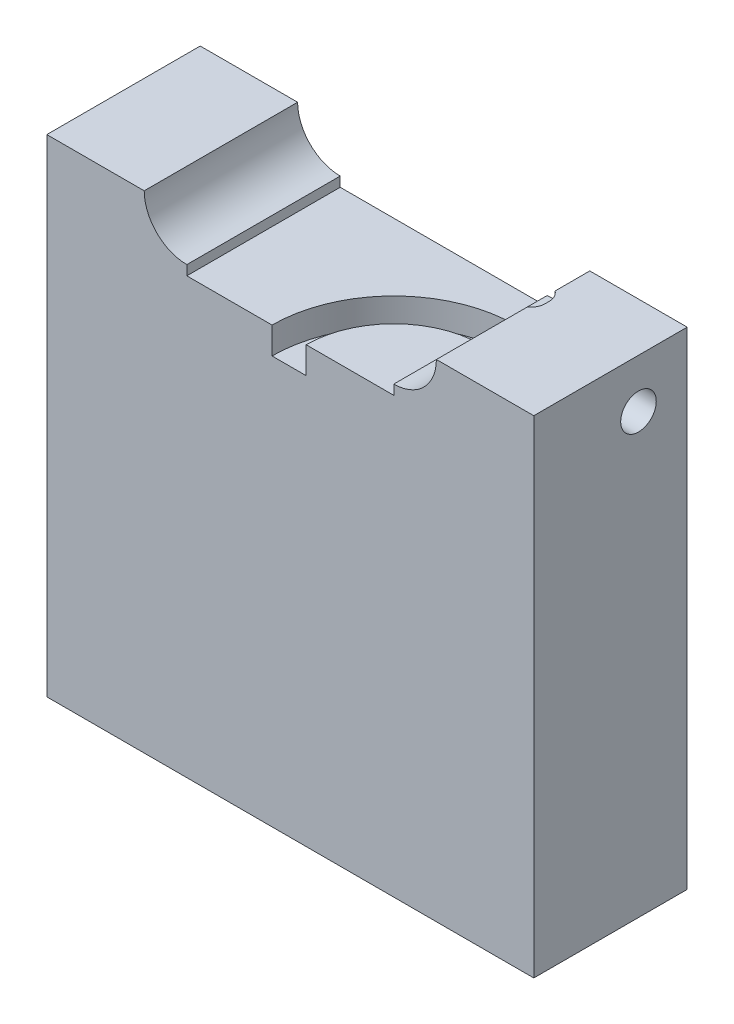
ISO-10303-21;
HEADER;
FILE_DESCRIPTION(('STEP AP214'),'2;1');
FILE_NAME('part.step','',(''),(''),'','','');
FILE_SCHEMA(('AUTOMOTIVE_DESIGN { 1 0 10303 214 1 1 1 1 }'));
ENDSEC;
DATA;
#1=APPLICATION_CONTEXT('core data for automotive mechanical design processes');
#2=APPLICATION_PROTOCOL_DEFINITION('international standard','automotive_design',2000,#1);
#3=PRODUCT_CONTEXT('',#1,'mechanical');
#4=PRODUCT('Part','Part','',(#3));
#5=PRODUCT_RELATED_PRODUCT_CATEGORY('part','',(#4));
#6=PRODUCT_DEFINITION_FORMATION('','',#4);
#7=PRODUCT_DEFINITION_CONTEXT('part definition',#1,'design');
#8=PRODUCT_DEFINITION('design','',#6,#7);
#9=PRODUCT_DEFINITION_SHAPE('','',#8);
#10=(LENGTH_UNIT() NAMED_UNIT(*) SI_UNIT(.MILLI.,.METRE.));
#11=(NAMED_UNIT(*) PLANE_ANGLE_UNIT() SI_UNIT($,.RADIAN.));
#12=(NAMED_UNIT(*) SI_UNIT($,.STERADIAN.) SOLID_ANGLE_UNIT());
#13=UNCERTAINTY_MEASURE_WITH_UNIT(LENGTH_MEASURE(1.E-05),#10,'distance_accuracy_value','');
#14=(GEOMETRIC_REPRESENTATION_CONTEXT(3) GLOBAL_UNCERTAINTY_ASSIGNED_CONTEXT((#13)) GLOBAL_UNIT_ASSIGNED_CONTEXT((#10,
#11,#12)) REPRESENTATION_CONTEXT('',''));
#15=CARTESIAN_POINT('',(0.,0.,0.));
#16=DIRECTION('',(0.,0.,1.));
#17=DIRECTION('',(1.,0.,0.));
#18=AXIS2_PLACEMENT_3D('',#15,#16,#17);
#19=CARTESIAN_POINT('',(5.3975,25.4,4.0005));
#20=DIRECTION('',(0.,-1.,0.));
#21=DIRECTION('',(1.,0.,0.));
#22=AXIS2_PLACEMENT_3D('',#19,#20,#21);
#23=CYLINDRICAL_SURFACE('',#22,6.35);
#24=DIRECTION('',(0.,-1.,0.));
#25=VECTOR('',#24,1.);
#26=CARTESIAN_POINT('',(5.3975,25.4,-2.3495));
#27=LINE('',#26,#25);
#28=CARTESIAN_POINT('',(5.3975,22.6695,-2.3495));
#29=VERTEX_POINT('',#28);
#30=CARTESIAN_POINT('',(5.3975,21.2725,-2.3495));
#31=VERTEX_POINT('',#30);
#32=EDGE_CURVE('E452',#29,#31,#27,.T.);
#33=ORIENTED_EDGE('',*,*,#32,.F.);
#34=CARTESIAN_POINT('',(5.3975,22.6695,4.0005));
#35=DIRECTION('',(0.,1.,0.));
#36=DIRECTION('',(-1.,0.,0.));
#37=AXIS2_PLACEMENT_3D('',#34,#35,#36);
#38=CIRCLE('',#37,6.35);
#39=CARTESIAN_POINT('',(-0.9525,22.6695,4.0005));
#40=VERTEX_POINT('',#39);
#41=EDGE_CURVE('E239',#29,#40,#38,.T.);
#42=ORIENTED_EDGE('',*,*,#41,.T.);
#43=DIRECTION('',(0.,-1.,0.));
#44=VECTOR('',#43,1.);
#45=CARTESIAN_POINT('',(-0.952499999999999,25.4,4.0005));
#46=LINE('',#45,#44);
#47=CARTESIAN_POINT('',(-0.952500000000001,21.2725,4.0005));
#48=VERTEX_POINT('',#47);
#49=EDGE_CURVE('E230',#40,#48,#46,.T.);
#50=ORIENTED_EDGE('',*,*,#49,.T.);
#51=CARTESIAN_POINT('',(5.3975,21.2725,4.0005));
#52=DIRECTION('',(0.,1.,0.));
#53=DIRECTION('',(-1.,0.,0.));
#54=AXIS2_PLACEMENT_3D('',#51,#52,#53);
#55=CIRCLE('',#54,6.35);
#56=EDGE_CURVE('E468',#31,#48,#55,.T.);
#57=ORIENTED_EDGE('',*,*,#56,.F.);
#58=EDGE_LOOP('',(#33,#42,#50,#57));
#59=FACE_BOUND('',#58,.T.);
#60=ADVANCED_FACE('F33',(#59),#23,.F.);
#61=CARTESIAN_POINT('',(5.3975,25.4,4.0005));
#62=DIRECTION('',(0.,-1.,0.));
#63=DIRECTION('',(1.,0.,0.));
#64=AXIS2_PLACEMENT_3D('',#61,#62,#63);
#65=CYLINDRICAL_SURFACE('',#64,4.572);
#66=DIRECTION('',(0.,-1.,0.));
#67=VECTOR('',#66,1.);
#68=CARTESIAN_POINT('',(0.825500000000001,25.4,4.0005));
#69=LINE('',#68,#67);
#70=CARTESIAN_POINT('',(0.8255,22.6695,4.0005));
#71=VERTEX_POINT('',#70);
#72=CARTESIAN_POINT('',(0.825499999999999,21.2725,4.0005));
#73=VERTEX_POINT('',#72);
#74=EDGE_CURVE('E450',#71,#73,#69,.T.);
#75=ORIENTED_EDGE('',*,*,#74,.F.);
#76=CARTESIAN_POINT('',(5.3975,22.6695,4.0005));
#77=DIRECTION('',(0.,1.,0.));
#78=DIRECTION('',(-1.,0.,0.));
#79=AXIS2_PLACEMENT_3D('',#76,#77,#78);
#80=CIRCLE('',#79,4.572);
#81=CARTESIAN_POINT('',(5.3975,22.6695,-0.571499999999999));
#82=VERTEX_POINT('',#81);
#83=EDGE_CURVE('E11',#71,#82,#80,.F.);
#84=ORIENTED_EDGE('',*,*,#83,.T.);
#85=DIRECTION('',(0.,-1.,0.));
#86=VECTOR('',#85,1.);
#87=CARTESIAN_POINT('',(5.3975,25.4,-0.571499999999999));
#88=LINE('',#87,#86);
#89=CARTESIAN_POINT('',(5.3975,21.2725,-0.571499999999999));
#90=VERTEX_POINT('',#89);
#91=EDGE_CURVE('E428',#82,#90,#88,.T.);
#92=ORIENTED_EDGE('',*,*,#91,.T.);
#93=CARTESIAN_POINT('',(5.3975,21.2725,4.0005));
#94=DIRECTION('',(0.,-1.,0.));
#95=DIRECTION('',(-1.,0.,0.));
#96=AXIS2_PLACEMENT_3D('',#93,#94,#95);
#97=CIRCLE('',#96,4.572);
#98=EDGE_CURVE('E444',#73,#90,#97,.T.);
#99=ORIENTED_EDGE('',*,*,#98,.F.);
#100=EDGE_LOOP('',(#75,#84,#92,#99));
#101=FACE_BOUND('',#100,.T.);
#102=ADVANCED_FACE('F515',(#101),#65,.T.);
#103=CARTESIAN_POINT('',(7.14375,25.4,-1.36525));
#104=DIRECTION('',(0.,-1.,0.));
#105=DIRECTION('',(1.,0.,0.));
#106=AXIS2_PLACEMENT_3D('',#103,#104,#105);
#107=CYLINDRICAL_SURFACE('',#106,0.79375);
#108=CARTESIAN_POINT('',(7.14375,23.1230464027505,-0.571499999999999));
#109=CARTESIAN_POINT('',(7.15893791785662,23.1229781622669,-0.57148921704763));
#110=CARTESIAN_POINT('',(7.17400569118337,23.124520458918,-0.571934888400934));
#111=CARTESIAN_POINT('',(7.2033431203434,23.1300966910771,-0.573609679749041));
#112=CARTESIAN_POINT('',(7.2176225803887,23.1340818079715,-0.574823464377439));
#113=CARTESIAN_POINT('',(7.25380469471549,23.1468082711699,-0.578843564999055));
#114=CARTESIAN_POINT('',(7.27512209176527,23.1569686475094,-0.582168697431571));
#115=CARTESIAN_POINT('',(7.31633968048021,23.1797623078841,-0.590203083478792));
#116=CARTESIAN_POINT('',(7.3362195987784,23.1924240312471,-0.594928600893243));
#117=CARTESIAN_POINT('',(7.37787042940221,23.2211125710446,-0.606458135167337));
#118=CARTESIAN_POINT('',(7.39943301006975,23.2373533586215,-0.613473986199112));
#119=CARTESIAN_POINT('',(7.44138305141542,23.270593693588,-0.629075213734984));
#120=CARTESIAN_POINT('',(7.46176933083153,23.2875939742988,-0.637662133053712));
#121=CARTESIAN_POINT('',(7.52143193640342,23.3389203174978,-0.665728056056787));
#122=CARTESIAN_POINT('',(7.5593005677582,23.3736393239732,-0.687537596010284));
#123=CARTESIAN_POINT('',(7.6384185132863,23.448430775985,-0.742299278746401));
#124=CARTESIAN_POINT('',(7.67896795887997,23.4882846809269,-0.776574581298044));
#125=CARTESIAN_POINT('',(7.75403094099642,23.5640168410449,-0.854840077472445));
#126=CARTESIAN_POINT('',(7.78855810799547,23.5999040050053,-0.898807808999805));
#127=CARTESIAN_POINT('',(7.83769152755565,23.6526476479051,-0.97824481695104));
#128=CARTESIAN_POINT('',(7.85491185054323,23.6715928274382,-1.01071440914583));
#129=CARTESIAN_POINT('',(7.88511096397852,23.7059280219605,-1.07921260408973));
#130=CARTESIAN_POINT('',(7.89810333803432,23.721329374934,-1.11522931488016));
#131=CARTESIAN_POINT('',(7.91781786866114,23.7462994434745,-1.18619777652733));
#132=CARTESIAN_POINT('',(7.92506881061526,23.7563207127409,-1.22083829691442));
#133=CARTESIAN_POINT('',(7.93245517265906,23.768352232104,-1.27409390820124));
#134=CARTESIAN_POINT('',(7.93433608261142,23.7718715687023,-1.29214513676568));
#135=CARTESIAN_POINT('',(7.93686009185863,23.7778440916586,-1.3285246385013));
#136=CARTESIAN_POINT('',(7.93750208529729,23.7802963240094,-1.34685314447942));
#137=CARTESIAN_POINT('',(7.9375,23.782194040048,-1.36525));
#138=B_SPLINE_CURVE_WITH_KNOTS('',3,(#108,#109,#110,#111,#112,#113,#114,#115,#116,#117,#118,
#119,#120,#121,#122,#123,#124,#125,#126,#127,#128,#129,#130,#131,#132,#133,#134,#135,#136,#137),
.UNSPECIFIED.,.F.,.F.,(4,2,2,2,2,2,2,2,2,2,2,2,2,2,4),(0.,0.0452895664750743,0.0897022840237438,
0.160849075138673,0.232856893385683,0.316417547963794,0.400060705247954,0.567007309525601,
0.765293828106061,0.963125562501132,1.08674096362218,1.2099551978823,1.31975004138663,
1.37514445888962,1.43058829859037),.UNSPECIFIED.);
#139=CARTESIAN_POINT('',(7.14375,23.1230464027505,-0.571499999999999));
#140=VERTEX_POINT('',#139);
#141=CARTESIAN_POINT('',(7.9375,23.782194040048,-1.36525));
#142=VERTEX_POINT('',#141);
#143=EDGE_CURVE('E288',#140,#142,#138,.T.);
#144=ORIENTED_EDGE('',*,*,#143,.F.);
#145=DIRECTION('',(0.,-1.,0.));
#146=VECTOR('',#145,1.);
#147=CARTESIAN_POINT('',(7.14375,25.4,-0.571499999999999));
#148=LINE('',#147,#146);
#149=CARTESIAN_POINT('',(7.14375,24.0251846714922,-0.571499999999999));
#150=VERTEX_POINT('',#149);
#151=EDGE_CURVE('E420',#150,#140,#148,.T.);
#152=ORIENTED_EDGE('',*,*,#151,.F.);
#153=CARTESIAN_POINT('',(7.14375,24.0251846714922,-0.571499999999999));
#154=CARTESIAN_POINT('',(7.17493882903404,24.0647904593139,-0.571515966067028));
#155=CARTESIAN_POINT('',(7.20473558813774,24.1054189700609,-0.573336101510383));
#156=CARTESIAN_POINT('',(7.26136996565832,24.1883868944046,-0.579743127296266));
#157=CARTESIAN_POINT('',(7.28821258149453,24.2307232477426,-0.58432525746599));
#158=CARTESIAN_POINT('',(7.3389098633342,24.316975133551,-0.595428843915839));
#159=CARTESIAN_POINT('',(7.36275997006245,24.3608929475555,-0.601953209514282));
#160=CARTESIAN_POINT('',(7.40738778736858,24.4500808312739,-0.616195180263885));
#161=CARTESIAN_POINT('',(7.4281640525646,24.4953515251891,-0.623913343295498));
#162=CARTESIAN_POINT('',(7.48841301880205,24.6391746871459,-0.648856798326211));
#163=CARTESIAN_POINT('',(7.52239504808017,24.7399758849743,-0.666944970405778));
#164=CARTESIAN_POINT('',(7.56234987491672,24.89428448952,-0.690674889170688));
#165=CARTESIAN_POINT('',(7.57382524483121,24.9461801786835,-0.698011648198737));
#166=CARTESIAN_POINT('',(7.59305267803054,25.0508824439455,-0.710803547908302));
#167=CARTESIAN_POINT('',(7.6008067955423,25.1036885007802,-0.716259726248792));
#168=CARTESIAN_POINT('',(7.61108668898027,25.1970681393693,-0.723637621390587));
#169=CARTESIAN_POINT('',(7.6144233283184,25.2375119988091,-0.726094970736021));
#170=CARTESIAN_POINT('',(7.61888265518496,25.3186335235272,-0.729411979066943));
#171=CARTESIAN_POINT('',(7.62000273710662,25.359311407665,-0.730269757657389));
#172=CARTESIAN_POINT('',(7.62,25.4,-0.730250000000001));
#173=B_SPLINE_CURVE_WITH_KNOTS('',3,(#153,#154,#155,#156,#157,#158,#159,#160,#161,#162,#163,
#164,#165,#166,#167,#168,#169,#170,#171,#172),.UNSPECIFIED.,.F.,.F.,(4,2,2,2,2,2,2,2,2,4),(0.,
0.151091968467235,0.301924278346462,0.452983670059184,0.604113868697302,0.926493060198708,
1.08733203777103,1.2480821256733,1.36996150858661,1.49198407820245),.UNSPECIFIED.);
#174=CARTESIAN_POINT('',(7.62,25.4,-0.730250000000001));
#175=VERTEX_POINT('',#174);
#176=EDGE_CURVE('E310',#150,#175,#173,.T.);
#177=ORIENTED_EDGE('',*,*,#176,.T.);
#178=CARTESIAN_POINT('',(7.14375,25.4,-1.36525));
#179=DIRECTION('',(0.,1.,0.));
#180=DIRECTION('',(1.,0.,0.));
#181=AXIS2_PLACEMENT_3D('',#178,#179,#180);
#182=CIRCLE('',#181,0.79375);
#183=CARTESIAN_POINT('',(7.9375,25.4,-1.36525));
#184=VERTEX_POINT('',#183);
#185=EDGE_CURVE('E438',#175,#184,#182,.T.);
#186=ORIENTED_EDGE('',*,*,#185,.T.);
#187=DIRECTION('',(0.,-1.,0.));
#188=VECTOR('',#187,1.);
#189=CARTESIAN_POINT('',(7.9375,25.4,-1.36525));
#190=LINE('',#189,#188);
#191=EDGE_CURVE('E355',#184,#142,#190,.T.);
#192=ORIENTED_EDGE('',*,*,#191,.T.);
#193=EDGE_LOOP('',(#144,#152,#177,#186,#192));
#194=FACE_BOUND('',#193,.T.);
#195=ADVANCED_FACE('F302',(#194),#107,.F.);
#196=CARTESIAN_POINT('',(7.14375,25.4,-1.55575));
#197=DIRECTION('',(0.,-1.,0.));
#198=DIRECTION('',(1.,0.,0.));
#199=AXIS2_PLACEMENT_3D('',#196,#197,#198);
#200=CYLINDRICAL_SURFACE('',#199,0.79375);
#201=CARTESIAN_POINT('',(7.9375,23.782194040048,-1.55575));
#202=CARTESIAN_POINT('',(7.93750241256332,23.7801936525798,-1.57514478348495));
#203=CARTESIAN_POINT('',(7.93678870871886,23.7775767551003,-1.5944621743929));
#204=CARTESIAN_POINT('',(7.93398641219166,23.7711587801819,-1.63277953405351));
#205=CARTESIAN_POINT('',(7.93189915885152,23.7673588582055,-1.65177979355258));
#206=CARTESIAN_POINT('',(7.92371352293545,23.7543339271178,-1.70775715508424));
#207=CARTESIAN_POINT('',(7.91568889593077,23.7434433707352,-1.74408855282001));
#208=CARTESIAN_POINT('',(7.89523776010599,23.7179176659708,-1.81387248338225));
#209=CARTESIAN_POINT('',(7.88282703010999,23.7032959918654,-1.8473348082929));
#210=CARTESIAN_POINT('',(7.85435108605226,23.6709943364583,-1.9111502135495));
#211=CARTESIAN_POINT('',(7.83827706911013,23.6533070133269,-1.9414955446917));
#212=CARTESIAN_POINT('',(7.7950458041358,23.6068268517615,-2.01212150391445));
#213=CARTESIAN_POINT('',(7.76620526596445,23.5766872046281,-2.05048526942747));
#214=CARTESIAN_POINT('',(7.7038617611406,23.5131883580013,-2.12011411534587));
#215=CARTESIAN_POINT('',(7.67034850885851,23.4798221071251,-2.1513631238535));
#216=CARTESIAN_POINT('',(7.59865541927082,23.4104677895308,-2.20785803437785));
#217=CARTESIAN_POINT('',(7.56037261542772,23.3744328617208,-2.23291527401671));
#218=CARTESIAN_POINT('',(7.50013032175957,23.3206006600362,-2.26536164838984));
#219=CARTESIAN_POINT('',(7.47959277776842,23.3027037493227,-2.27531618012629));
#220=CARTESIAN_POINT('',(7.43740812370541,23.2673727822183,-2.29353925463318));
#221=CARTESIAN_POINT('',(7.41576180347948,23.249938409412,-2.30180897725127));
#222=CARTESIAN_POINT('',(7.37545059999081,23.2195567149893,-2.31516497950012));
#223=CARTESIAN_POINT('',(7.35704266951005,23.206403873353,-2.32055739616009));
#224=CARTESIAN_POINT('',(7.31896103433901,23.1815037640402,-2.33017004709823));
#225=CARTESIAN_POINT('',(7.29928734644972,23.169756477713,-2.33439029693117));
#226=CARTESIAN_POINT('',(7.26442510912181,23.1521227309386,-2.34040819331776));
#227=CARTESIAN_POINT('',(7.2496600372804,23.1455350172339,-2.34255282231827));
#228=CARTESIAN_POINT('',(7.21928974650044,23.134519893377,-2.34604332277608));
#229=CARTESIAN_POINT('',(7.20368955538529,23.1300808834197,-2.34739349186303));
#230=CARTESIAN_POINT('',(7.18055609109638,23.1258076177804,-2.34867942917183));
#231=CARTESIAN_POINT('',(7.17325894960944,23.1247822406778,-2.34898501857166));
#232=CARTESIAN_POINT('',(7.15856018619976,23.1233972488647,-2.34939622095228));
#233=CARTESIAN_POINT('',(7.15115822518164,23.1230409698786,-2.34950083203409));
#234=CARTESIAN_POINT('',(7.14375,23.1230464027505,-2.3495));
#235=B_SPLINE_CURVE_WITH_KNOTS('',3,(#201,#202,#203,#204,#205,#206,#207,#208,#209,#210,#211,
#212,#213,#214,#215,#216,#217,#218,#219,#220,#221,#222,#223,#224,#225,#226,#227,#228,#229,#230,
#231,#232,#233,#234),.UNSPECIFIED.,.F.,.F.,(4,2,2,2,2,2,2,2,2,2,2,2,2,2,2,2,4),(0.,
0.0584453265147484,0.116833747504299,0.232488737897986,0.347731829907224,0.463254826944109,
0.632339979221334,0.801803378714479,0.975925812136694,1.06288483108186,1.14978274295621,
1.21949579483512,1.28920792157083,1.33802178064912,1.38656909412918,1.40866379827516,
1.43086836401874),.UNSPECIFIED.);
#236=CARTESIAN_POINT('',(7.9375,23.782194040048,-1.55575));
#237=VERTEX_POINT('',#236);
#238=CARTESIAN_POINT('',(7.14375,23.1230464027505,-2.3495));
#239=VERTEX_POINT('',#238);
#240=EDGE_CURVE('E283',#237,#239,#235,.T.);
#241=ORIENTED_EDGE('',*,*,#240,.F.);
#242=DIRECTION('',(0.,-1.,0.));
#243=VECTOR('',#242,1.);
#244=CARTESIAN_POINT('',(7.9375,25.4,-1.55575));
#245=LINE('',#244,#243);
#246=CARTESIAN_POINT('',(7.9375,25.4,-1.55575));
#247=VERTEX_POINT('',#246);
#248=EDGE_CURVE('E345',#247,#237,#245,.T.);
#249=ORIENTED_EDGE('',*,*,#248,.F.);
#250=CARTESIAN_POINT('',(7.14375,25.4,-1.55575));
#251=DIRECTION('',(0.,1.,0.));
#252=DIRECTION('',(-1.,0.,0.));
#253=AXIS2_PLACEMENT_3D('',#250,#251,#252);
#254=CIRCLE('',#253,0.79375);
#255=CARTESIAN_POINT('',(7.62,25.4,-2.19075));
#256=VERTEX_POINT('',#255);
#257=EDGE_CURVE('E441',#247,#256,#254,.T.);
#258=ORIENTED_EDGE('',*,*,#257,.T.);
#259=CARTESIAN_POINT('',(7.62,25.4,-2.19075));
#260=CARTESIAN_POINT('',(7.62000808222504,25.3476620086764,-2.19069678540611));
#261=CARTESIAN_POINT('',(7.61815174304964,25.2953473715379,-2.19213629686457));
#262=CARTESIAN_POINT('',(7.61078125391763,25.1911829924741,-2.19758908145641));
#263=CARTESIAN_POINT('',(7.60527233116839,25.1393326933517,-2.20159867627471));
#264=CARTESIAN_POINT('',(7.59066211493761,25.0363268479517,-2.21178576557001));
#265=CARTESIAN_POINT('',(7.58155825030525,24.9851718260926,-2.21796481131604));
#266=CARTESIAN_POINT('',(7.55984658447069,24.8838125931217,-2.23181870998652));
#267=CARTESIAN_POINT('',(7.5472375453096,24.8336087246421,-2.23949409110067));
#268=CARTESIAN_POINT('',(7.50289921844771,24.6799016765049,-2.26443820747756));
#269=CARTESIAN_POINT('',(7.46535418005992,24.5782472369929,-2.2830066799425));
#270=CARTESIAN_POINT('',(7.37568261057651,24.3812061917664,-2.31636202096677));
#271=CARTESIAN_POINT('',(7.32360883953244,24.2857984212855,-2.33116220863326));
#272=CARTESIAN_POINT('',(7.2458227786617,24.1653311257623,-2.3431368661238));
#273=CARTESIAN_POINT('',(7.22636452973083,24.1366863514485,-2.34544747485569));
#274=CARTESIAN_POINT('',(7.18607326983955,24.0802594935604,-2.34862852535922));
#275=CARTESIAN_POINT('',(7.16523897881772,24.0524782496364,-2.34949760595795));
#276=CARTESIAN_POINT('',(7.14375,24.0251846714922,-2.3495));
#277=B_SPLINE_CURVE_WITH_KNOTS('',3,(#259,#260,#261,#262,#263,#264,#265,#266,#267,#268,#269,
#270,#271,#272,#273,#274,#275,#276),.UNSPECIFIED.,.F.,.F.,(4,2,2,2,2,2,2,2,4),(0.,
0.156923704265639,0.313623318561808,0.470435210112986,0.627302555066314,0.955983364493301,
1.28348578985539,1.38754499314609,1.49170239923896),.UNSPECIFIED.);
#278=CARTESIAN_POINT('',(7.14375,24.0251846714922,-2.3495));
#279=VERTEX_POINT('',#278);
#280=EDGE_CURVE('E321',#256,#279,#277,.T.);
#281=ORIENTED_EDGE('',*,*,#280,.T.);
#282=DIRECTION('',(0.,-1.,0.));
#283=VECTOR('',#282,1.);
#284=CARTESIAN_POINT('',(7.14375,25.4,-2.3495));
#285=LINE('',#284,#283);
#286=EDGE_CURVE('E348',#279,#239,#285,.T.);
#287=ORIENTED_EDGE('',*,*,#286,.T.);
#288=EDGE_LOOP('',(#241,#249,#258,#281,#287));
#289=FACE_BOUND('',#288,.T.);
#290=ADVANCED_FACE('F344',(#289),#200,.F.);
#291=CARTESIAN_POINT('',(7.9375,25.4,-1.36525));
#292=DIRECTION('',(-1.,0.,0.));
#293=DIRECTION('',(0.,-1.,0.));
#294=AXIS2_PLACEMENT_3D('',#291,#292,#293);
#295=PLANE('',#294);
#296=CARTESIAN_POINT('',(7.9375,22.86,-1.4605));
#297=DIRECTION('',(-1.,0.,0.));
#298=DIRECTION('',(0.,-1.,0.));
#299=AXIS2_PLACEMENT_3D('',#296,#297,#298);
#300=CIRCLE('',#299,0.9271);
#301=EDGE_CURVE('E327',#142,#237,#300,.T.);
#302=ORIENTED_EDGE('',*,*,#301,.F.);
#303=ORIENTED_EDGE('',*,*,#191,.F.);
#304=DIRECTION('',(0.,0.,-1.));
#305=VECTOR('',#304,1.);
#306=CARTESIAN_POINT('',(7.9375,25.4,-1.36525));
#307=LINE('',#306,#305);
#308=EDGE_CURVE('E351',#184,#247,#307,.T.);
#309=ORIENTED_EDGE('',*,*,#308,.T.);
#310=ORIENTED_EDGE('',*,*,#248,.T.);
#311=EDGE_LOOP('',(#302,#303,#309,#310));
#312=FACE_BOUND('',#311,.T.);
#313=ADVANCED_FACE('F349',(#312),#295,.T.);
#314=CARTESIAN_POINT('',(-12.7,25.4,4.0005));
#315=DIRECTION('',(0.,0.,-1.));
#316=DIRECTION('',(-1.,0.,0.));
#317=AXIS2_PLACEMENT_3D('',#314,#315,#316);
#318=PLANE('',#317);
#319=DIRECTION('',(1.,0.,0.));
#320=VECTOR('',#319,1.);
#321=CARTESIAN_POINT('',(-5.3975,22.6695,4.0005));
#322=LINE('',#321,#320);
#323=CARTESIAN_POINT('',(-5.3975,22.6695,4.0005));
#324=VERTEX_POINT('',#323);
#325=EDGE_CURVE('E221',#324,#40,#322,.T.);
#326=ORIENTED_EDGE('',*,*,#325,.F.);
#327=DIRECTION('',(0.,1.,0.));
#328=VECTOR('',#327,1.);
#329=CARTESIAN_POINT('',(-5.3975,22.6695,4.0005));
#330=LINE('',#329,#328);
#331=CARTESIAN_POINT('',(-5.3975,23.1775,4.0005));
#332=VERTEX_POINT('',#331);
#333=EDGE_CURVE('E205',#324,#332,#330,.T.);
#334=ORIENTED_EDGE('',*,*,#333,.T.);
#335=CARTESIAN_POINT('',(-5.3975,25.4,4.0005));
#336=DIRECTION('',(0.,0.,-1.));
#337=DIRECTION('',(-1.,0.,0.));
#338=AXIS2_PLACEMENT_3D('',#335,#336,#337);
#339=CIRCLE('',#338,2.2225);
#340=CARTESIAN_POINT('',(-7.62,25.4,4.0005));
#341=VERTEX_POINT('',#340);
#342=EDGE_CURVE('E372',#332,#341,#339,.T.);
#343=ORIENTED_EDGE('',*,*,#342,.T.);
#344=DIRECTION('',(1.,0.,0.));
#345=VECTOR('',#344,1.);
#346=CARTESIAN_POINT('',(-12.7,25.4,4.0005));
#347=LINE('',#346,#345);
#348=CARTESIAN_POINT('',(-12.7,25.4,4.0005));
#349=VERTEX_POINT('',#348);
#350=EDGE_CURVE('E386',#349,#341,#347,.T.);
#351=ORIENTED_EDGE('',*,*,#350,.F.);
#352=DIRECTION('',(0.,-1.,0.));
#353=VECTOR('',#352,1.);
#354=CARTESIAN_POINT('',(-12.7,25.4,4.0005));
#355=LINE('',#354,#353);
#356=CARTESIAN_POINT('',(-12.7,0.,4.0005));
#357=VERTEX_POINT('',#356);
#358=EDGE_CURVE('E399',#349,#357,#355,.T.);
#359=ORIENTED_EDGE('',*,*,#358,.T.);
#360=DIRECTION('',(1.,0.,0.));
#361=VECTOR('',#360,1.);
#362=CARTESIAN_POINT('',(-12.7,0.,4.0005));
#363=LINE('',#362,#361);
#364=CARTESIAN_POINT('',(12.7,0.,4.0005));
#365=VERTEX_POINT('',#364);
#366=EDGE_CURVE('E379',#357,#365,#363,.T.);
#367=ORIENTED_EDGE('',*,*,#366,.T.);
#368=DIRECTION('',(0.,-1.,0.));
#369=VECTOR('',#368,1.);
#370=CARTESIAN_POINT('',(12.7,25.4,4.0005));
#371=LINE('',#370,#369);
#372=CARTESIAN_POINT('',(12.7,25.4,4.0005));
#373=VERTEX_POINT('',#372);
#374=EDGE_CURVE('E389',#373,#365,#371,.T.);
#375=ORIENTED_EDGE('',*,*,#374,.F.);
#376=CARTESIAN_POINT('',(7.62,25.4,4.0005));
#377=VERTEX_POINT('',#376);
#378=EDGE_CURVE('E385',#377,#373,#347,.T.);
#379=ORIENTED_EDGE('',*,*,#378,.F.);
#380=CARTESIAN_POINT('',(5.3975,25.4,4.0005));
#381=DIRECTION('',(0.,0.,-1.));
#382=DIRECTION('',(-1.,0.,0.));
#383=AXIS2_PLACEMENT_3D('',#380,#381,#382);
#384=CIRCLE('',#383,2.2225);
#385=CARTESIAN_POINT('',(5.3975,23.1775,4.0005));
#386=VERTEX_POINT('',#385);
#387=EDGE_CURVE('E367',#377,#386,#384,.T.);
#388=ORIENTED_EDGE('',*,*,#387,.T.);
#389=DIRECTION('',(0.,1.,0.));
#390=VECTOR('',#389,1.);
#391=CARTESIAN_POINT('',(5.3975,22.6695,4.0005));
#392=LINE('',#391,#390);
#393=CARTESIAN_POINT('',(5.3975,22.6695,4.0005));
#394=VERTEX_POINT('',#393);
#395=EDGE_CURVE('E216',#394,#386,#392,.T.);
#396=ORIENTED_EDGE('',*,*,#395,.F.);
#397=EDGE_CURVE('E225',#71,#394,#322,.T.);
#398=ORIENTED_EDGE('',*,*,#397,.F.);
#399=ORIENTED_EDGE('',*,*,#74,.T.);
#400=DIRECTION('',(1.,0.,0.));
#401=VECTOR('',#400,1.);
#402=CARTESIAN_POINT('',(0.825499999999999,21.2725,4.0005));
#403=LINE('',#402,#401);
#404=EDGE_CURVE('E471',#48,#73,#403,.T.);
#405=ORIENTED_EDGE('',*,*,#404,.F.);
#406=ORIENTED_EDGE('',*,*,#49,.F.);
#407=EDGE_LOOP('',(#326,#334,#343,#351,#359,#367,#375,#379,#388,#396,#398,#399,#405,#406));
#408=FACE_BOUND('',#407,.T.);
#409=ADVANCED_FACE('F228',(#408),#318,.F.);
#410=CARTESIAN_POINT('',(0.,25.4,0.));
#411=DIRECTION('',(0.,-1.,0.));
#412=DIRECTION('',(0.,0.,-1.));
#413=AXIS2_PLACEMENT_3D('',#410,#411,#412);
#414=PLANE('',#413);
#415=ORIENTED_EDGE('',*,*,#185,.F.);
#416=DIRECTION('',(0.,0.,-1.));
#417=VECTOR('',#416,1.);
#418=CARTESIAN_POINT('',(7.62,25.4,21.3995));
#419=LINE('',#418,#417);
#420=EDGE_CURVE('E408',#175,#377,#419,.F.);
#421=ORIENTED_EDGE('',*,*,#420,.T.);
#422=ORIENTED_EDGE('',*,*,#378,.T.);
#423=DIRECTION('',(0.,0.,-1.));
#424=VECTOR('',#423,1.);
#425=CARTESIAN_POINT('',(12.7,25.4,4.0005));
#426=LINE('',#425,#424);
#427=CARTESIAN_POINT('',(12.7,25.4,-4.0005));
#428=VERTEX_POINT('',#427);
#429=EDGE_CURVE('E375',#373,#428,#426,.T.);
#430=ORIENTED_EDGE('',*,*,#429,.T.);
#431=DIRECTION('',(-1.,0.,0.));
#432=VECTOR('',#431,1.);
#433=CARTESIAN_POINT('',(-12.7,25.4,-4.0005));
#434=LINE('',#433,#432);
#435=CARTESIAN_POINT('',(7.62,25.4,-4.0005));
#436=VERTEX_POINT('',#435);
#437=EDGE_CURVE('E380',#428,#436,#434,.T.);
#438=ORIENTED_EDGE('',*,*,#437,.T.);
#439=EDGE_CURVE('E409',#436,#256,#419,.F.);
#440=ORIENTED_EDGE('',*,*,#439,.T.);
#441=ORIENTED_EDGE('',*,*,#257,.F.);
#442=ORIENTED_EDGE('',*,*,#308,.F.);
#443=EDGE_LOOP('',(#415,#421,#422,#430,#438,#440,#441,#442));
#444=FACE_BOUND('',#443,.T.);
#445=ADVANCED_FACE('F436',(#444),#414,.F.);
#446=CARTESIAN_POINT('',(5.3975,25.4,21.3995));
#447=DIRECTION('',(0.,0.,-1.));
#448=DIRECTION('',(-1.,0.,0.));
#449=AXIS2_PLACEMENT_3D('',#446,#447,#448);
#450=CYLINDRICAL_SURFACE('',#449,2.2225);
#451=ORIENTED_EDGE('',*,*,#280,.F.);
#452=ORIENTED_EDGE('',*,*,#439,.F.);
#453=CARTESIAN_POINT('',(5.3975,25.4,-4.0005));
#454=DIRECTION('',(0.,0.,-1.));
#455=DIRECTION('',(-1.,0.,0.));
#456=AXIS2_PLACEMENT_3D('',#453,#454,#455);
#457=CIRCLE('',#456,2.2225);
#458=CARTESIAN_POINT('',(5.3975,23.1775,-4.0005));
#459=VERTEX_POINT('',#458);
#460=EDGE_CURVE('E362',#436,#459,#457,.T.);
#461=ORIENTED_EDGE('',*,*,#460,.T.);
#462=DIRECTION('',(0.,0.,-1.));
#463=VECTOR('',#462,1.);
#464=CARTESIAN_POINT('',(5.3975,23.1775,21.3995));
#465=LINE('',#464,#463);
#466=CARTESIAN_POINT('',(5.3975,23.1775,-2.3495));
#467=VERTEX_POINT('',#466);
#468=EDGE_CURVE('E365',#467,#459,#465,.T.);
#469=ORIENTED_EDGE('',*,*,#468,.F.);
#470=CARTESIAN_POINT('',(5.3975,25.4,-2.3495));
#471=DIRECTION('',(0.,0.,1.));
#472=DIRECTION('',(1.,0.,0.));
#473=AXIS2_PLACEMENT_3D('',#470,#471,#472);
#474=CIRCLE('',#473,2.2225);
#475=EDGE_CURVE('E316',#279,#467,#474,.F.);
#476=ORIENTED_EDGE('',*,*,#475,.F.);
#477=EDGE_LOOP('',(#451,#452,#461,#469,#476));
#478=FACE_BOUND('',#477,.T.);
#479=ADVANCED_FACE('F304',(#478),#450,.F.);
#480=ORIENTED_EDGE('',*,*,#176,.F.);
#481=CARTESIAN_POINT('',(5.3975,25.4,-0.571499999999999));
#482=DIRECTION('',(0.,0.,-1.));
#483=DIRECTION('',(-1.,0.,0.));
#484=AXIS2_PLACEMENT_3D('',#481,#482,#483);
#485=CIRCLE('',#484,2.2225);
#486=CARTESIAN_POINT('',(5.3975,23.1775,-0.571499999999999));
#487=VERTEX_POINT('',#486);
#488=EDGE_CURVE('E317',#487,#150,#485,.F.);
#489=ORIENTED_EDGE('',*,*,#488,.F.);
#490=EDGE_CURVE('E368',#386,#487,#465,.T.);
#491=ORIENTED_EDGE('',*,*,#490,.F.);
#492=ORIENTED_EDGE('',*,*,#387,.F.);
#493=ORIENTED_EDGE('',*,*,#420,.F.);
#494=EDGE_LOOP('',(#480,#489,#491,#492,#493));
#495=FACE_BOUND('',#494,.T.);
#496=ADVANCED_FACE('F432',(#495),#450,.F.);
#497=ORIENTED_EDGE('',*,*,#350,.T.);
#498=DIRECTION('',(0.,0.,-1.));
#499=VECTOR('',#498,1.);
#500=CARTESIAN_POINT('',(-7.62,25.4,21.3995));
#501=LINE('',#500,#499);
#502=CARTESIAN_POINT('',(-7.62,25.4,-4.0005));
#503=VERTEX_POINT('',#502);
#504=EDGE_CURVE('E411',#341,#503,#501,.T.);
#505=ORIENTED_EDGE('',*,*,#504,.T.);
#506=CARTESIAN_POINT('',(-12.7,25.4,-4.0005));
#507=VERTEX_POINT('',#506);
#508=EDGE_CURVE('E378',#503,#507,#434,.T.);
#509=ORIENTED_EDGE('',*,*,#508,.T.);
#510=DIRECTION('',(0.,0.,1.));
#511=VECTOR('',#510,1.);
#512=CARTESIAN_POINT('',(-12.7,25.4,4.0005));
#513=LINE('',#512,#511);
#514=EDGE_CURVE('E383',#507,#349,#513,.T.);
#515=ORIENTED_EDGE('',*,*,#514,.T.);
#516=EDGE_LOOP('',(#497,#505,#509,#515));
#517=FACE_BOUND('',#516,.T.);
#518=ADVANCED_FACE('F572',(#517),#414,.F.);
#519=CARTESIAN_POINT('',(12.7,25.4,4.0005));
#520=DIRECTION('',(-1.,0.,0.));
#521=DIRECTION('',(0.,0.,1.));
#522=AXIS2_PLACEMENT_3D('',#519,#520,#521);
#523=PLANE('',#522);
#524=CARTESIAN_POINT('',(12.7,22.86,-1.4605));
#525=DIRECTION('',(1.,0.,0.));
#526=DIRECTION('',(0.,0.,-1.));
#527=AXIS2_PLACEMENT_3D('',#524,#525,#526);
#528=CIRCLE('',#527,0.9271);
#529=CARTESIAN_POINT('',(12.7,22.86,-2.3876));
#530=VERTEX_POINT('',#529);
#531=EDGE_CURVE('E245',#530,#530,#528,.T.);
#532=ORIENTED_EDGE('',*,*,#531,.F.);
#533=EDGE_LOOP('',(#532));
#534=FACE_BOUND('',#533,.T.);
#535=DIRECTION('',(0.,0.,-1.));
#536=VECTOR('',#535,1.);
#537=CARTESIAN_POINT('',(12.7,0.,4.0005));
#538=LINE('',#537,#536);
#539=CARTESIAN_POINT('',(12.7,0.,-4.0005));
#540=VERTEX_POINT('',#539);
#541=EDGE_CURVE('E374',#365,#540,#538,.T.);
#542=ORIENTED_EDGE('',*,*,#541,.T.);
#543=DIRECTION('',(0.,-1.,0.));
#544=VECTOR('',#543,1.);
#545=CARTESIAN_POINT('',(12.7,25.4,-4.0005));
#546=LINE('',#545,#544);
#547=EDGE_CURVE('E405',#428,#540,#546,.T.);
#548=ORIENTED_EDGE('',*,*,#547,.F.);
#549=ORIENTED_EDGE('',*,*,#429,.F.);
#550=ORIENTED_EDGE('',*,*,#374,.T.);
#551=EDGE_LOOP('',(#542,#548,#549,#550));
#552=FACE_BOUND('',#551,.T.);
#553=ADVANCED_FACE('F35',(#534,#552),#523,.F.);
#554=CARTESIAN_POINT('',(-12.7,25.4,-4.0005));
#555=DIRECTION('',(0.,0.,1.));
#556=DIRECTION('',(1.,0.,0.));
#557=AXIS2_PLACEMENT_3D('',#554,#555,#556);
#558=PLANE('',#557);
#559=CARTESIAN_POINT('',(-5.3975,25.4,-4.0005));
#560=DIRECTION('',(0.,0.,-1.));
#561=DIRECTION('',(-1.,0.,0.));
#562=AXIS2_PLACEMENT_3D('',#559,#560,#561);
#563=CIRCLE('',#562,2.2225);
#564=CARTESIAN_POINT('',(-5.3975,23.1775,-4.0005));
#565=VERTEX_POINT('',#564);
#566=EDGE_CURVE('E360',#565,#503,#563,.T.);
#567=ORIENTED_EDGE('',*,*,#566,.F.);
#568=DIRECTION('',(0.,1.,0.));
#569=VECTOR('',#568,1.);
#570=CARTESIAN_POINT('',(-5.3975,22.6695,-4.0005));
#571=LINE('',#570,#569);
#572=CARTESIAN_POINT('',(-5.3975,22.6695,-4.0005));
#573=VERTEX_POINT('',#572);
#574=EDGE_CURVE('E237',#573,#565,#571,.T.);
#575=ORIENTED_EDGE('',*,*,#574,.F.);
#576=DIRECTION('',(-1.,0.,0.));
#577=VECTOR('',#576,1.);
#578=CARTESIAN_POINT('',(-5.3975,22.6695,-4.0005));
#579=LINE('',#578,#577);
#580=CARTESIAN_POINT('',(5.3975,22.6695,-4.0005));
#581=VERTEX_POINT('',#580);
#582=EDGE_CURVE('E217',#581,#573,#579,.T.);
#583=ORIENTED_EDGE('',*,*,#582,.F.);
#584=DIRECTION('',(0.,1.,0.));
#585=VECTOR('',#584,1.);
#586=CARTESIAN_POINT('',(5.3975,22.6695,-4.0005));
#587=LINE('',#586,#585);
#588=EDGE_CURVE('E240',#581,#459,#587,.T.);
#589=ORIENTED_EDGE('',*,*,#588,.T.);
#590=ORIENTED_EDGE('',*,*,#460,.F.);
#591=ORIENTED_EDGE('',*,*,#437,.F.);
#592=ORIENTED_EDGE('',*,*,#547,.T.);
#593=DIRECTION('',(-1.,0.,0.));
#594=VECTOR('',#593,1.);
#595=CARTESIAN_POINT('',(-12.7,0.,-4.0005));
#596=LINE('',#595,#594);
#597=CARTESIAN_POINT('',(-12.7,0.,-4.0005));
#598=VERTEX_POINT('',#597);
#599=EDGE_CURVE('E392',#540,#598,#596,.T.);
#600=ORIENTED_EDGE('',*,*,#599,.T.);
#601=DIRECTION('',(0.,-1.,0.));
#602=VECTOR('',#601,1.);
#603=CARTESIAN_POINT('',(-12.7,25.4,-4.0005));
#604=LINE('',#603,#602);
#605=EDGE_CURVE('E402',#507,#598,#604,.T.);
#606=ORIENTED_EDGE('',*,*,#605,.F.);
#607=ORIENTED_EDGE('',*,*,#508,.F.);
#608=EDGE_LOOP('',(#567,#575,#583,#589,#590,#591,#592,#600,#606,#607));
#609=FACE_BOUND('',#608,.T.);
#610=ADVANCED_FACE('F578',(#609),#558,.F.);
#611=CARTESIAN_POINT('',(-12.7,25.4,4.0005));
#612=DIRECTION('',(1.,0.,0.));
#613=DIRECTION('',(0.,0.,-1.));
#614=AXIS2_PLACEMENT_3D('',#611,#612,#613);
#615=PLANE('',#614);
#616=DIRECTION('',(0.,0.,1.));
#617=VECTOR('',#616,1.);
#618=CARTESIAN_POINT('',(-12.7,0.,4.0005));
#619=LINE('',#618,#617);
#620=EDGE_CURVE('E394',#598,#357,#619,.T.);
#621=ORIENTED_EDGE('',*,*,#620,.T.);
#622=ORIENTED_EDGE('',*,*,#358,.F.);
#623=ORIENTED_EDGE('',*,*,#514,.F.);
#624=ORIENTED_EDGE('',*,*,#605,.T.);
#625=EDGE_LOOP('',(#621,#622,#623,#624));
#626=FACE_BOUND('',#625,.T.);
#627=ADVANCED_FACE('F583',(#626),#615,.F.);
#628=CARTESIAN_POINT('',(0.,0.,0.));
#629=DIRECTION('',(0.,-1.,0.));
#630=DIRECTION('',(0.,0.,-1.));
#631=AXIS2_PLACEMENT_3D('',#628,#629,#630);
#632=PLANE('',#631);
#633=ORIENTED_EDGE('',*,*,#541,.F.);
#634=ORIENTED_EDGE('',*,*,#366,.F.);
#635=ORIENTED_EDGE('',*,*,#620,.F.);
#636=ORIENTED_EDGE('',*,*,#599,.F.);
#637=EDGE_LOOP('',(#633,#634,#635,#636));
#638=FACE_BOUND('',#637,.T.);
#639=ADVANCED_FACE('F594',(#638),#632,.T.);
#640=CARTESIAN_POINT('',(-5.3975,25.4,21.3995));
#641=DIRECTION('',(0.,0.,-1.));
#642=DIRECTION('',(-1.,0.,0.));
#643=AXIS2_PLACEMENT_3D('',#640,#641,#642);
#644=CYLINDRICAL_SURFACE('',#643,2.2225);
#645=DIRECTION('',(0.,0.,-1.));
#646=VECTOR('',#645,1.);
#647=CARTESIAN_POINT('',(-5.3975,23.1775,21.3995));
#648=LINE('',#647,#646);
#649=EDGE_CURVE('E211',#332,#565,#648,.T.);
#650=ORIENTED_EDGE('',*,*,#649,.T.);
#651=ORIENTED_EDGE('',*,*,#566,.T.);
#652=ORIENTED_EDGE('',*,*,#504,.F.);
#653=ORIENTED_EDGE('',*,*,#342,.F.);
#654=EDGE_LOOP('',(#650,#651,#652,#653));
#655=FACE_BOUND('',#654,.T.);
#656=ADVANCED_FACE('F300',(#655),#644,.F.);
#657=CARTESIAN_POINT('',(7.9375,21.937805959952,-1.36525));
#658=CARTESIAN_POINT('',(7.93750241256332,21.9398063474202,-1.34585521651505));
#659=CARTESIAN_POINT('',(7.93678870871886,21.9424232448997,-1.3265378256071));
#660=CARTESIAN_POINT('',(7.93398641219166,21.9488412198181,-1.28822046594649));
#661=CARTESIAN_POINT('',(7.93189915885152,21.9526411417945,-1.26922020644742));
#662=CARTESIAN_POINT('',(7.92371352293545,21.9656660728822,-1.21324284491576));
#663=CARTESIAN_POINT('',(7.91568889593077,21.9765566292647,-1.17691144717999));
#664=CARTESIAN_POINT('',(7.89523776010599,22.0020823340292,-1.10712751661774));
#665=CARTESIAN_POINT('',(7.88282703010999,22.0167040081346,-1.0736651917071));
#666=CARTESIAN_POINT('',(7.85435108605226,22.0490056635417,-1.0098497864505));
#667=CARTESIAN_POINT('',(7.83827706911013,22.0666929866731,-0.979504455308302));
#668=CARTESIAN_POINT('',(7.7950458041358,22.1131731482385,-0.908878496085548));
#669=CARTESIAN_POINT('',(7.76620526596444,22.1433127953719,-0.870514730572526));
#670=CARTESIAN_POINT('',(7.7038617611406,22.2068116419987,-0.80088588465413));
#671=CARTESIAN_POINT('',(7.67034850885851,22.2401778928749,-0.769636876146502));
#672=CARTESIAN_POINT('',(7.59865541927082,22.3095322104692,-0.713141965622146));
#673=CARTESIAN_POINT('',(7.56037261542772,22.3455671382792,-0.688084725983286));
#674=CARTESIAN_POINT('',(7.50013032175957,22.3993993399638,-0.655638351610156));
#675=CARTESIAN_POINT('',(7.47959277776843,22.4172962506773,-0.645683819873712));
#676=CARTESIAN_POINT('',(7.43740812370541,22.4526272177817,-0.62746074536682));
#677=CARTESIAN_POINT('',(7.41576180347948,22.470061590588,-0.61919102274873));
#678=CARTESIAN_POINT('',(7.37545059999081,22.5004432850107,-0.605835020499883));
#679=CARTESIAN_POINT('',(7.35704266951006,22.513596126647,-0.60044260383991));
#680=CARTESIAN_POINT('',(7.31896103433902,22.5384962359598,-0.590829952901765));
#681=CARTESIAN_POINT('',(7.29928734644972,22.550243522287,-0.586609703068826));
#682=CARTESIAN_POINT('',(7.26442510912181,22.5678772690614,-0.580591806682241));
#683=CARTESIAN_POINT('',(7.2496600372804,22.5744649827661,-0.578447177681725));
#684=CARTESIAN_POINT('',(7.21928974650044,22.585480106623,-0.574956677223916));
#685=CARTESIAN_POINT('',(7.20368955538529,22.5899191165803,-0.573606508136971));
#686=CARTESIAN_POINT('',(7.18055609109638,22.5941923822196,-0.572320570828168));
#687=CARTESIAN_POINT('',(7.17325894960944,22.5952177593222,-0.572014981428341));
#688=CARTESIAN_POINT('',(7.15856018619976,22.5966027511353,-0.571603779047718));
#689=CARTESIAN_POINT('',(7.15115822518164,22.5969590301214,-0.571499167965912));
#690=CARTESIAN_POINT('',(7.14375,22.5969535972495,-0.571499999999999));
#691=B_SPLINE_CURVE_WITH_KNOTS('',3,(#657,#658,#659,#660,#661,#662,#663,#664,#665,#666,#667,
#668,#669,#670,#671,#672,#673,#674,#675,#676,#677,#678,#679,#680,#681,#682,#683,#684,#685,#686,
#687,#688,#689,#690),.UNSPECIFIED.,.F.,.F.,(4,2,2,2,2,2,2,2,2,2,2,2,2,2,2,2,4),(0.,
0.058445326514748,0.116833747504299,0.232488737897986,0.347731829907223,0.463254826944109,
0.63233997922134,0.80180337871448,0.975925812136693,1.06288483108186,1.14978274295621,
1.21949579483512,1.28920792157083,1.33802178064912,1.38656909412918,1.40866379827516,
1.43086836401874),.UNSPECIFIED.);
#692=CARTESIAN_POINT('',(7.9375,21.937805959952,-1.36525));
#693=VERTEX_POINT('',#692);
#694=CARTESIAN_POINT('',(7.14375,22.5969535972495,-0.571499999999999));
#695=VERTEX_POINT('',#694);
#696=EDGE_CURVE('E258',#693,#695,#691,.T.);
#697=ORIENTED_EDGE('',*,*,#696,.F.);
#698=CARTESIAN_POINT('',(7.9375,21.2725,-1.36525));
#699=VERTEX_POINT('',#698);
#700=EDGE_CURVE('E352',#693,#699,#190,.T.);
#701=ORIENTED_EDGE('',*,*,#700,.T.);
#702=CARTESIAN_POINT('',(7.14375,21.2725,-1.36525));
#703=DIRECTION('',(0.,1.,0.));
#704=DIRECTION('',(1.,0.,0.));
#705=AXIS2_PLACEMENT_3D('',#702,#703,#704);
#706=CIRCLE('',#705,0.79375);
#707=CARTESIAN_POINT('',(7.14375,21.2725,-0.571499999999999));
#708=VERTEX_POINT('',#707);
#709=EDGE_CURVE('E491',#708,#699,#706,.T.);
#710=ORIENTED_EDGE('',*,*,#709,.F.);
#711=EDGE_CURVE('E429',#695,#708,#148,.T.);
#712=ORIENTED_EDGE('',*,*,#711,.F.);
#713=EDGE_LOOP('',(#697,#701,#710,#712));
#714=FACE_BOUND('',#713,.T.);
#715=ADVANCED_FACE('F296',(#714),#107,.F.);
#716=CARTESIAN_POINT('',(7.14375,22.5969535972495,-2.3495));
#717=CARTESIAN_POINT('',(7.15893791785662,22.5970218377331,-2.34951078295237));
#718=CARTESIAN_POINT('',(7.17400569118337,22.595479541082,-2.34906511159906));
#719=CARTESIAN_POINT('',(7.2033431203434,22.5899033089228,-2.34739032025096));
#720=CARTESIAN_POINT('',(7.21762258038871,22.5859181920285,-2.34617653562256));
#721=CARTESIAN_POINT('',(7.25380469471549,22.57319172883,-2.34215643500094));
#722=CARTESIAN_POINT('',(7.27512209176527,22.5630313524906,-2.33883130256843));
#723=CARTESIAN_POINT('',(7.31633968048021,22.5402376921159,-2.33079691652121));
#724=CARTESIAN_POINT('',(7.3362195987784,22.5275759687529,-2.32607139910675));
#725=CARTESIAN_POINT('',(7.37787042940221,22.4988874289553,-2.31454186483266));
#726=CARTESIAN_POINT('',(7.39943301006976,22.4826466413785,-2.30752601380088));
#727=CARTESIAN_POINT('',(7.44138305141543,22.449406306412,-2.29192478626501));
#728=CARTESIAN_POINT('',(7.46176933083154,22.4324060257012,-2.28333786694628));
#729=CARTESIAN_POINT('',(7.52143193640342,22.3810796825022,-2.25527194394321));
#730=CARTESIAN_POINT('',(7.55930056775821,22.3463606760268,-2.23346240398971));
#731=CARTESIAN_POINT('',(7.63841851328631,22.271569224015,-2.17870072125359));
#732=CARTESIAN_POINT('',(7.67896795887998,22.2317153190731,-2.14442541870195));
#733=CARTESIAN_POINT('',(7.75403094099643,22.1559831589551,-2.06615992252754));
#734=CARTESIAN_POINT('',(7.78855810799548,22.1200959949947,-2.02219219100018));
#735=CARTESIAN_POINT('',(7.83769152755566,22.0673523520949,-1.94275518304895));
#736=CARTESIAN_POINT('',(7.85491185054323,22.0484071725618,-1.91028559085416));
#737=CARTESIAN_POINT('',(7.88511096397852,22.0140719780394,-1.84178739591025));
#738=CARTESIAN_POINT('',(7.89810333803432,21.998670625066,-1.80577068511982));
#739=CARTESIAN_POINT('',(7.91781786866114,21.9737005565255,-1.73480222347266));
#740=CARTESIAN_POINT('',(7.92506881061526,21.9636792872591,-1.70016170308557));
#741=CARTESIAN_POINT('',(7.93245517265906,21.951647767896,-1.64690609179876));
#742=CARTESIAN_POINT('',(7.93433608261142,21.9481284312977,-1.62885486323431));
#743=CARTESIAN_POINT('',(7.93686009185863,21.9421559083414,-1.59247536149869));
#744=CARTESIAN_POINT('',(7.93750208529729,21.9397036759906,-1.57414685552058));
#745=CARTESIAN_POINT('',(7.9375,21.937805959952,-1.55575));
#746=B_SPLINE_CURVE_WITH_KNOTS('',3,(#716,#717,#718,#719,#720,#721,#722,#723,#724,#725,#726,
#727,#728,#729,#730,#731,#732,#733,#734,#735,#736,#737,#738,#739,#740,#741,#742,#743,#744,#745),
.UNSPECIFIED.,.F.,.F.,(4,2,2,2,2,2,2,2,2,2,2,2,2,2,4),(0.,0.0452895664750731,0.0897022840237443,
0.160849075138677,0.232856893385687,0.316417547963805,0.400060705247965,0.567007309525613,
0.765293828106071,0.963125562501145,1.08674096362219,1.20995519788231,1.31975004138663,
1.37514445888962,1.43058829859037),.UNSPECIFIED.);
#747=CARTESIAN_POINT('',(7.14375,22.5969535972495,-2.3495));
#748=VERTEX_POINT('',#747);
#749=CARTESIAN_POINT('',(7.9375,21.937805959952,-1.55575));
#750=VERTEX_POINT('',#749);
#751=EDGE_CURVE('E56',#748,#750,#746,.T.);
#752=ORIENTED_EDGE('',*,*,#751,.F.);
#753=CARTESIAN_POINT('',(7.14375,21.2725,-2.3495));
#754=VERTEX_POINT('',#753);
#755=EDGE_CURVE('E455',#748,#754,#285,.T.);
#756=ORIENTED_EDGE('',*,*,#755,.T.);
#757=CARTESIAN_POINT('',(7.14375,21.2725,-1.55575));
#758=DIRECTION('',(0.,1.,0.));
#759=DIRECTION('',(-1.,0.,0.));
#760=AXIS2_PLACEMENT_3D('',#757,#758,#759);
#761=CIRCLE('',#760,0.79375);
#762=CARTESIAN_POINT('',(7.9375,21.2725,-1.55575));
#763=VERTEX_POINT('',#762);
#764=EDGE_CURVE('E476',#763,#754,#761,.T.);
#765=ORIENTED_EDGE('',*,*,#764,.F.);
#766=EDGE_CURVE('E353',#750,#763,#245,.T.);
#767=ORIENTED_EDGE('',*,*,#766,.F.);
#768=EDGE_LOOP('',(#752,#756,#765,#767));
#769=FACE_BOUND('',#768,.T.);
#770=ADVANCED_FACE('F264',(#769),#200,.F.);
#771=CARTESIAN_POINT('',(7.14375,25.4,-2.3495));
#772=DIRECTION('',(0.,0.,1.));
#773=DIRECTION('',(1.,0.,0.));
#774=AXIS2_PLACEMENT_3D('',#771,#772,#773);
#775=PLANE('',#774);
#776=DIRECTION('',(1.,0.,0.));
#777=VECTOR('',#776,1.);
#778=CARTESIAN_POINT('',(6.35,22.5969535972495,-2.3495));
#779=LINE('',#778,#777);
#780=CARTESIAN_POINT('',(6.35,22.5969535972495,-2.3495));
#781=VERTEX_POINT('',#780);
#782=EDGE_CURVE('E289',#781,#748,#779,.T.);
#783=ORIENTED_EDGE('',*,*,#782,.F.);
#784=DIRECTION('',(0.,1.,0.));
#785=VECTOR('',#784,1.);
#786=CARTESIAN_POINT('',(6.35,25.4,-2.3495));
#787=LINE('',#786,#785);
#788=CARTESIAN_POINT('',(6.35,23.1230464027505,-2.3495));
#789=VERTEX_POINT('',#788);
#790=EDGE_CURVE('E494',#781,#789,#787,.T.);
#791=ORIENTED_EDGE('',*,*,#790,.T.);
#792=DIRECTION('',(1.,0.,0.));
#793=VECTOR('',#792,1.);
#794=CARTESIAN_POINT('',(6.35,23.1230464027505,-2.3495));
#795=LINE('',#794,#793);
#796=EDGE_CURVE('E497',#239,#789,#795,.F.);
#797=ORIENTED_EDGE('',*,*,#796,.F.);
#798=ORIENTED_EDGE('',*,*,#286,.F.);
#799=ORIENTED_EDGE('',*,*,#475,.T.);
#800=EDGE_CURVE('E453',#467,#29,#27,.T.);
#801=ORIENTED_EDGE('',*,*,#800,.T.);
#802=ORIENTED_EDGE('',*,*,#32,.T.);
#803=DIRECTION('',(-1.,0.,0.));
#804=VECTOR('',#803,1.);
#805=CARTESIAN_POINT('',(7.14375,21.2725,-2.3495));
#806=LINE('',#805,#804);
#807=EDGE_CURVE('E464',#754,#31,#806,.T.);
#808=ORIENTED_EDGE('',*,*,#807,.F.);
#809=ORIENTED_EDGE('',*,*,#755,.F.);
#810=EDGE_LOOP('',(#783,#791,#797,#798,#799,#801,#802,#808,#809));
#811=FACE_BOUND('',#810,.T.);
#812=ADVANCED_FACE('F461',(#811),#775,.T.);
#813=CARTESIAN_POINT('',(5.3975,25.4,-0.571499999999999));
#814=DIRECTION('',(0.,0.,-1.));
#815=DIRECTION('',(-1.,0.,0.));
#816=AXIS2_PLACEMENT_3D('',#813,#814,#815);
#817=PLANE('',#816);
#818=DIRECTION('',(1.,0.,0.));
#819=VECTOR('',#818,1.);
#820=CARTESIAN_POINT('',(6.35,23.1230464027505,-0.571499999999999));
#821=LINE('',#820,#819);
#822=CARTESIAN_POINT('',(6.35,23.1230464027505,-0.571499999999999));
#823=VERTEX_POINT('',#822);
#824=EDGE_CURVE('E294',#823,#140,#821,.T.);
#825=ORIENTED_EDGE('',*,*,#824,.F.);
#826=DIRECTION('',(0.,-1.,0.));
#827=VECTOR('',#826,1.);
#828=CARTESIAN_POINT('',(6.35,25.4,-0.571499999999999));
#829=LINE('',#828,#827);
#830=CARTESIAN_POINT('',(6.35,22.5969535972495,-0.571499999999999));
#831=VERTEX_POINT('',#830);
#832=EDGE_CURVE('E41',#823,#831,#829,.T.);
#833=ORIENTED_EDGE('',*,*,#832,.T.);
#834=DIRECTION('',(1.,0.,0.));
#835=VECTOR('',#834,1.);
#836=CARTESIAN_POINT('',(6.35,22.5969535972495,-0.571499999999999));
#837=LINE('',#836,#835);
#838=EDGE_CURVE('E489',#695,#831,#837,.F.);
#839=ORIENTED_EDGE('',*,*,#838,.F.);
#840=ORIENTED_EDGE('',*,*,#711,.T.);
#841=DIRECTION('',(1.,0.,0.));
#842=VECTOR('',#841,1.);
#843=CARTESIAN_POINT('',(5.3975,21.2725,-0.571499999999999));
#844=LINE('',#843,#842);
#845=EDGE_CURVE('E439',#90,#708,#844,.T.);
#846=ORIENTED_EDGE('',*,*,#845,.F.);
#847=ORIENTED_EDGE('',*,*,#91,.F.);
#848=EDGE_CURVE('E422',#487,#82,#88,.T.);
#849=ORIENTED_EDGE('',*,*,#848,.F.);
#850=ORIENTED_EDGE('',*,*,#488,.T.);
#851=ORIENTED_EDGE('',*,*,#151,.T.);
#852=EDGE_LOOP('',(#825,#833,#839,#840,#846,#847,#849,#850,#851));
#853=FACE_BOUND('',#852,.T.);
#854=ADVANCED_FACE('F419',(#853),#817,.T.);
#855=EDGE_CURVE('E326',#750,#693,#300,.T.);
#856=ORIENTED_EDGE('',*,*,#855,.F.);
#857=ORIENTED_EDGE('',*,*,#766,.T.);
#858=DIRECTION('',(0.,0.,-1.));
#859=VECTOR('',#858,1.);
#860=CARTESIAN_POINT('',(7.9375,21.2725,-1.36525));
#861=LINE('',#860,#859);
#862=EDGE_CURVE('E478',#699,#763,#861,.T.);
#863=ORIENTED_EDGE('',*,*,#862,.F.);
#864=ORIENTED_EDGE('',*,*,#700,.F.);
#865=EDGE_LOOP('',(#856,#857,#863,#864));
#866=FACE_BOUND('',#865,.T.);
#867=ADVANCED_FACE('F303',(#866),#295,.T.);
#868=CARTESIAN_POINT('',(7.14375,21.2725,-1.36525));
#869=DIRECTION('',(0.,-1.,0.));
#870=DIRECTION('',(1.,0.,0.));
#871=AXIS2_PLACEMENT_3D('',#868,#869,#870);
#872=PLANE('',#871);
#873=ORIENTED_EDGE('',*,*,#709,.T.);
#874=ORIENTED_EDGE('',*,*,#862,.T.);
#875=ORIENTED_EDGE('',*,*,#764,.T.);
#876=ORIENTED_EDGE('',*,*,#807,.T.);
#877=ORIENTED_EDGE('',*,*,#56,.T.);
#878=ORIENTED_EDGE('',*,*,#404,.T.);
#879=ORIENTED_EDGE('',*,*,#98,.T.);
#880=ORIENTED_EDGE('',*,*,#845,.T.);
#881=EDGE_LOOP('',(#873,#874,#875,#876,#877,#878,#879,#880));
#882=FACE_BOUND('',#881,.T.);
#883=ADVANCED_FACE('F276',(#882),#872,.F.);
#884=CARTESIAN_POINT('',(6.35,22.86,-1.4605));
#885=DIRECTION('',(1.,0.,0.));
#886=DIRECTION('',(0.,0.,-1.));
#887=AXIS2_PLACEMENT_3D('',#884,#885,#886);
#888=PLANE('',#887);
#889=CARTESIAN_POINT('',(6.35,22.86,-1.4605));
#890=DIRECTION('',(1.,0.,0.));
#891=DIRECTION('',(0.,0.,-1.));
#892=AXIS2_PLACEMENT_3D('',#889,#890,#891);
#893=CIRCLE('',#892,0.9271);
#894=EDGE_CURVE('E246',#781,#789,#893,.T.);
#895=ORIENTED_EDGE('',*,*,#894,.T.);
#896=ORIENTED_EDGE('',*,*,#790,.F.);
#897=EDGE_LOOP('',(#895,#896));
#898=FACE_BOUND('',#897,.T.);
#899=ADVANCED_FACE('F274',(#898),#888,.T.);
#900=CARTESIAN_POINT('',(6.35,22.86,-1.4605));
#901=DIRECTION('',(1.,0.,0.));
#902=DIRECTION('',(0.,0.,-1.));
#903=AXIS2_PLACEMENT_3D('',#900,#901,#902);
#904=CYLINDRICAL_SURFACE('',#903,0.9271);
#905=ORIENTED_EDGE('',*,*,#796,.T.);
#906=ORIENTED_EDGE('',*,*,#894,.F.);
#907=ORIENTED_EDGE('',*,*,#782,.T.);
#908=ORIENTED_EDGE('',*,*,#751,.T.);
#909=ORIENTED_EDGE('',*,*,#855,.T.);
#910=ORIENTED_EDGE('',*,*,#696,.T.);
#911=ORIENTED_EDGE('',*,*,#838,.T.);
#912=EDGE_CURVE('E249',#823,#831,#893,.T.);
#913=ORIENTED_EDGE('',*,*,#912,.F.);
#914=ORIENTED_EDGE('',*,*,#824,.T.);
#915=ORIENTED_EDGE('',*,*,#143,.T.);
#916=ORIENTED_EDGE('',*,*,#301,.T.);
#917=ORIENTED_EDGE('',*,*,#240,.T.);
#918=EDGE_LOOP('',(#905,#906,#907,#908,#909,#910,#911,#913,#914,#915,#916,#917));
#919=FACE_BOUND('',#918,.T.);
#920=ORIENTED_EDGE('',*,*,#531,.T.);
#921=EDGE_LOOP('',(#920));
#922=FACE_BOUND('',#921,.T.);
#923=ADVANCED_FACE('F268',(#919,#922),#904,.F.);
#924=ORIENTED_EDGE('',*,*,#912,.T.);
#925=ORIENTED_EDGE('',*,*,#832,.F.);
#926=EDGE_LOOP('',(#924,#925));
#927=FACE_BOUND('',#926,.T.);
#928=ADVANCED_FACE('F273',(#927),#888,.T.);
#929=CARTESIAN_POINT('',(5.3975,22.6695,-4.0005));
#930=DIRECTION('',(1.,0.,0.));
#931=DIRECTION('',(0.,1.,0.));
#932=AXIS2_PLACEMENT_3D('',#929,#930,#931);
#933=PLANE('',#932);
#934=ORIENTED_EDGE('',*,*,#848,.T.);
#935=DIRECTION('',(0.,0.,-1.));
#936=VECTOR('',#935,1.);
#937=CARTESIAN_POINT('',(5.3975,22.6695,-4.0005));
#938=LINE('',#937,#936);
#939=EDGE_CURVE('E232',#394,#82,#938,.T.);
#940=ORIENTED_EDGE('',*,*,#939,.F.);
#941=ORIENTED_EDGE('',*,*,#395,.T.);
#942=ORIENTED_EDGE('',*,*,#490,.T.);
#943=EDGE_LOOP('',(#934,#940,#941,#942));
#944=FACE_BOUND('',#943,.T.);
#945=ADVANCED_FACE('F504',(#944),#933,.F.);
#946=CARTESIAN_POINT('',(0.,22.6695,0.));
#947=DIRECTION('',(0.,1.,0.));
#948=DIRECTION('',(-1.,0.,0.));
#949=AXIS2_PLACEMENT_3D('',#946,#947,#948);
#950=PLANE('',#949);
#951=ORIENTED_EDGE('',*,*,#397,.T.);
#952=ORIENTED_EDGE('',*,*,#939,.T.);
#953=ORIENTED_EDGE('',*,*,#83,.F.);
#954=EDGE_LOOP('',(#951,#952,#953));
#955=FACE_BOUND('',#954,.T.);
#956=ADVANCED_FACE('F508',(#955),#950,.T.);
#957=EDGE_CURVE('E48',#29,#581,#938,.T.);
#958=ORIENTED_EDGE('',*,*,#957,.T.);
#959=ORIENTED_EDGE('',*,*,#582,.T.);
#960=DIRECTION('',(0.,0.,1.));
#961=VECTOR('',#960,1.);
#962=CARTESIAN_POINT('',(-5.3975,22.6695,-4.0005));
#963=LINE('',#962,#961);
#964=EDGE_CURVE('E208',#573,#324,#963,.T.);
#965=ORIENTED_EDGE('',*,*,#964,.T.);
#966=ORIENTED_EDGE('',*,*,#325,.T.);
#967=ORIENTED_EDGE('',*,*,#41,.F.);
#968=EDGE_LOOP('',(#958,#959,#965,#966,#967));
#969=FACE_BOUND('',#968,.T.);
#970=ADVANCED_FACE('F220',(#969),#950,.T.);
#971=ORIENTED_EDGE('',*,*,#800,.F.);
#972=ORIENTED_EDGE('',*,*,#468,.T.);
#973=ORIENTED_EDGE('',*,*,#588,.F.);
#974=ORIENTED_EDGE('',*,*,#957,.F.);
#975=EDGE_LOOP('',(#971,#972,#973,#974));
#976=FACE_BOUND('',#975,.T.);
#977=ADVANCED_FACE('F511',(#976),#933,.F.);
#978=CARTESIAN_POINT('',(-5.3975,22.6695,-4.0005));
#979=DIRECTION('',(-1.,0.,0.));
#980=DIRECTION('',(0.,-1.,0.));
#981=AXIS2_PLACEMENT_3D('',#978,#979,#980);
#982=PLANE('',#981);
#983=ORIENTED_EDGE('',*,*,#649,.F.);
#984=ORIENTED_EDGE('',*,*,#333,.F.);
#985=ORIENTED_EDGE('',*,*,#964,.F.);
#986=ORIENTED_EDGE('',*,*,#574,.T.);
#987=EDGE_LOOP('',(#983,#984,#985,#986));
#988=FACE_BOUND('',#987,.T.);
#989=ADVANCED_FACE('F207',(#988),#982,.F.);
#990=CLOSED_SHELL('',(#60,#102,#195,#290,#313,#409,#445,#479,#496,#518,#553,#610,#627,#639,#656,
#715,#770,#812,#854,#867,#883,#899,#923,#928,#945,#956,#970,#977,#989));
#991=MANIFOLD_SOLID_BREP('B2',#990);
#992=ADVANCED_BREP_SHAPE_REPRESENTATION('',(#18,#991),#14);
#993=SHAPE_DEFINITION_REPRESENTATION(#9,#992);
ENDSEC;
END-ISO-10303-21;
